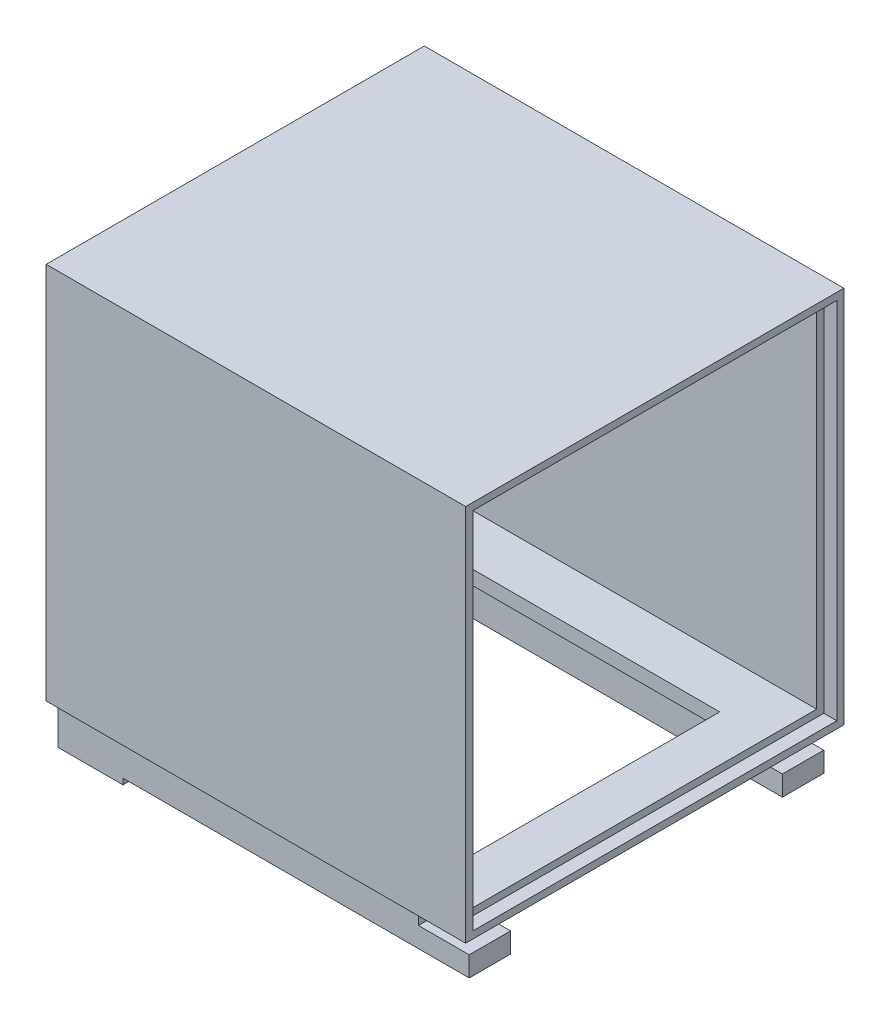
ISO-10303-21;
HEADER;
FILE_DESCRIPTION(('STEP AP214'),'2;1');
FILE_NAME('part.step','',(''),(''),'','','');
FILE_SCHEMA(('AUTOMOTIVE_DESIGN { 1 0 10303 214 1 1 1 1 }'));
ENDSEC;
DATA;
#1=APPLICATION_CONTEXT('core data for automotive mechanical design processes');
#2=APPLICATION_PROTOCOL_DEFINITION('international standard','automotive_design',2000,#1);
#3=PRODUCT_CONTEXT('',#1,'mechanical');
#4=PRODUCT('Part','Part','',(#3));
#5=PRODUCT_RELATED_PRODUCT_CATEGORY('part','',(#4));
#6=PRODUCT_DEFINITION_FORMATION('','',#4);
#7=PRODUCT_DEFINITION_CONTEXT('part definition',#1,'design');
#8=PRODUCT_DEFINITION('design','',#6,#7);
#9=PRODUCT_DEFINITION_SHAPE('','',#8);
#10=(LENGTH_UNIT() NAMED_UNIT(*) SI_UNIT(.MILLI.,.METRE.));
#11=(NAMED_UNIT(*) PLANE_ANGLE_UNIT() SI_UNIT($,.RADIAN.));
#12=(NAMED_UNIT(*) SI_UNIT($,.STERADIAN.) SOLID_ANGLE_UNIT());
#13=UNCERTAINTY_MEASURE_WITH_UNIT(LENGTH_MEASURE(1.E-05),#10,'distance_accuracy_value','');
#14=(GEOMETRIC_REPRESENTATION_CONTEXT(3) GLOBAL_UNCERTAINTY_ASSIGNED_CONTEXT((#13)) GLOBAL_UNIT_ASSIGNED_CONTEXT((#10,
#11,#12)) REPRESENTATION_CONTEXT('',''));
#15=CARTESIAN_POINT('',(0.,0.,0.));
#16=DIRECTION('',(0.,0.,1.));
#17=DIRECTION('',(1.,0.,0.));
#18=AXIS2_PLACEMENT_3D('',#15,#16,#17);
#19=CARTESIAN_POINT('',(0.,0.,0.));
#20=DIRECTION('',(0.,-1.,0.));
#21=DIRECTION('',(0.,0.,-1.));
#22=AXIS2_PLACEMENT_3D('',#19,#20,#21);
#23=PLANE('',#22);
#24=DIRECTION('',(0.,0.,-1.));
#25=VECTOR('',#24,1.);
#26=CARTESIAN_POINT('',(25.,0.,-55.));
#27=LINE('',#26,#25);
#28=CARTESIAN_POINT('',(25.,0.,-55.));
#29=VERTEX_POINT('',#28);
#30=CARTESIAN_POINT('',(25.,0.,-265.));
#31=VERTEX_POINT('',#30);
#32=EDGE_CURVE('E363',#29,#31,#27,.T.);
#33=ORIENTED_EDGE('',*,*,#32,.F.);
#34=DIRECTION('',(-1.,0.,0.));
#35=VECTOR('',#34,1.);
#36=CARTESIAN_POINT('',(25.,0.,-55.));
#37=LINE('',#36,#35);
#38=CARTESIAN_POINT('',(305.,0.,-55.));
#39=VERTEX_POINT('',#38);
#40=EDGE_CURVE('E371',#39,#29,#37,.T.);
#41=ORIENTED_EDGE('',*,*,#40,.F.);
#42=DIRECTION('',(0.,0.,1.));
#43=VECTOR('',#42,1.);
#44=CARTESIAN_POINT('',(305.,0.,-55.));
#45=LINE('',#44,#43);
#46=CARTESIAN_POINT('',(305.,0.,-265.));
#47=VERTEX_POINT('',#46);
#48=EDGE_CURVE('E368',#47,#39,#45,.T.);
#49=ORIENTED_EDGE('',*,*,#48,.F.);
#50=DIRECTION('',(1.,0.,0.));
#51=VECTOR('',#50,1.);
#52=CARTESIAN_POINT('',(25.,0.,-265.));
#53=LINE('',#52,#51);
#54=EDGE_CURVE('E365',#31,#47,#53,.T.);
#55=ORIENTED_EDGE('',*,*,#54,.F.);
#56=EDGE_LOOP('',(#33,#41,#49,#55));
#57=FACE_BOUND('',#56,.T.);
#58=DIRECTION('',(1.,0.,0.));
#59=VECTOR('',#58,1.);
#60=CARTESIAN_POINT('',(20.,0.,-45.));
#61=LINE('',#60,#59);
#62=CARTESIAN_POINT('',(20.,0.,-45.));
#63=VERTEX_POINT('',#62);
#64=CARTESIAN_POINT('',(305.,0.,-45.));
#65=VERTEX_POINT('',#64);
#66=EDGE_CURVE('E347',#63,#65,#61,.T.);
#67=ORIENTED_EDGE('',*,*,#66,.F.);
#68=DIRECTION('',(0.,0.,1.));
#69=VECTOR('',#68,1.);
#70=CARTESIAN_POINT('',(20.,0.,-10.));
#71=LINE('',#70,#69);
#72=CARTESIAN_POINT('',(20.,0.,-275.));
#73=VERTEX_POINT('',#72);
#74=EDGE_CURVE('E270',#73,#63,#71,.T.);
#75=ORIENTED_EDGE('',*,*,#74,.F.);
#76=DIRECTION('',(-1.,0.,0.));
#77=VECTOR('',#76,1.);
#78=CARTESIAN_POINT('',(20.,0.,-275.));
#79=LINE('',#78,#77);
#80=CARTESIAN_POINT('',(305.,0.,-275.));
#81=VERTEX_POINT('',#80);
#82=EDGE_CURVE('E333',#81,#73,#79,.T.);
#83=ORIENTED_EDGE('',*,*,#82,.F.);
#84=DIRECTION('',(0.,0.,1.));
#85=VECTOR('',#84,1.);
#86=CARTESIAN_POINT('',(305.,0.,-275.));
#87=LINE('',#86,#85);
#88=CARTESIAN_POINT('',(305.,0.,-310.));
#89=VERTEX_POINT('',#88);
#90=EDGE_CURVE('E335',#89,#81,#87,.T.);
#91=ORIENTED_EDGE('',*,*,#90,.F.);
#92=DIRECTION('',(1.,0.,0.));
#93=VECTOR('',#92,1.);
#94=CARTESIAN_POINT('',(20.,0.,-310.));
#95=LINE('',#94,#93);
#96=CARTESIAN_POINT('',(0.,0.,-310.));
#97=VERTEX_POINT('',#96);
#98=EDGE_CURVE('E328',#97,#89,#95,.T.);
#99=ORIENTED_EDGE('',*,*,#98,.F.);
#100=DIRECTION('',(0.,0.,1.));
#101=VECTOR('',#100,1.);
#102=CARTESIAN_POINT('',(0.,0.,0.));
#103=LINE('',#102,#101);
#104=CARTESIAN_POINT('',(0.,0.,-320.));
#105=VERTEX_POINT('',#104);
#106=EDGE_CURVE('E457',#105,#97,#103,.T.);
#107=ORIENTED_EDGE('',*,*,#106,.F.);
#108=DIRECTION('',(-1.,0.,0.));
#109=VECTOR('',#108,1.);
#110=CARTESIAN_POINT('',(0.,0.,-320.));
#111=LINE('',#110,#109);
#112=CARTESIAN_POINT('',(355.,0.,-320.));
#113=VERTEX_POINT('',#112);
#114=EDGE_CURVE('E450',#113,#105,#111,.T.);
#115=ORIENTED_EDGE('',*,*,#114,.F.);
#116=DIRECTION('',(0.,0.,-1.));
#117=VECTOR('',#116,1.);
#118=CARTESIAN_POINT('',(355.,0.,0.));
#119=LINE('',#118,#117);
#120=CARTESIAN_POINT('',(355.,0.,0.));
#121=VERTEX_POINT('',#120);
#122=EDGE_CURVE('E461',#121,#113,#119,.T.);
#123=ORIENTED_EDGE('',*,*,#122,.F.);
#124=DIRECTION('',(1.,0.,0.));
#125=VECTOR('',#124,1.);
#126=CARTESIAN_POINT('',(0.,0.,0.));
#127=LINE('',#126,#125);
#128=CARTESIAN_POINT('',(0.,0.,0.));
#129=VERTEX_POINT('',#128);
#130=EDGE_CURVE('E459',#129,#121,#127,.T.);
#131=ORIENTED_EDGE('',*,*,#130,.F.);
#132=CARTESIAN_POINT('',(0.,0.,-10.));
#133=VERTEX_POINT('',#132);
#134=EDGE_CURVE('E437',#133,#129,#103,.T.);
#135=ORIENTED_EDGE('',*,*,#134,.F.);
#136=DIRECTION('',(-1.,0.,0.));
#137=VECTOR('',#136,1.);
#138=CARTESIAN_POINT('',(20.,0.,-10.));
#139=LINE('',#138,#137);
#140=CARTESIAN_POINT('',(305.,0.,-10.));
#141=VERTEX_POINT('',#140);
#142=EDGE_CURVE('E262',#141,#133,#139,.T.);
#143=ORIENTED_EDGE('',*,*,#142,.F.);
#144=DIRECTION('',(0.,0.,1.));
#145=VECTOR('',#144,1.);
#146=CARTESIAN_POINT('',(305.,0.,-10.));
#147=LINE('',#146,#145);
#148=EDGE_CURVE('E353',#65,#141,#147,.T.);
#149=ORIENTED_EDGE('',*,*,#148,.F.);
#150=EDGE_LOOP('',(#67,#75,#83,#91,#99,#107,#115,#123,#131,#135,#143,#149));
#151=FACE_BOUND('',#150,.T.);
#152=ADVANCED_FACE('F42',(#57,#151),#23,.T.);
#153=CARTESIAN_POINT('',(0.,320.,0.));
#154=DIRECTION('',(1.,0.,0.));
#155=DIRECTION('',(0.,0.,-1.));
#156=AXIS2_PLACEMENT_3D('',#153,#154,#155);
#157=PLANE('',#156);
#158=ORIENTED_EDGE('',*,*,#106,.T.);
#159=DIRECTION('',(0.,1.,0.));
#160=VECTOR('',#159,1.);
#161=CARTESIAN_POINT('',(0.,-39.,-310.));
#162=LINE('',#161,#160);
#163=CARTESIAN_POINT('',(0.,-39.,-310.));
#164=VERTEX_POINT('',#163);
#165=EDGE_CURVE('E266',#164,#97,#162,.T.);
#166=ORIENTED_EDGE('',*,*,#165,.F.);
#167=DIRECTION('',(0.,0.,-1.));
#168=VECTOR('',#167,1.);
#169=CARTESIAN_POINT('',(0.,-39.,-10.));
#170=LINE('',#169,#168);
#171=CARTESIAN_POINT('',(0.,-39.,-10.));
#172=VERTEX_POINT('',#171);
#173=EDGE_CURVE('E249',#172,#164,#170,.T.);
#174=ORIENTED_EDGE('',*,*,#173,.F.);
#175=DIRECTION('',(0.,1.,0.));
#176=VECTOR('',#175,1.);
#177=CARTESIAN_POINT('',(0.,-39.,-10.));
#178=LINE('',#177,#176);
#179=EDGE_CURVE('E259',#172,#133,#178,.T.);
#180=ORIENTED_EDGE('',*,*,#179,.T.);
#181=ORIENTED_EDGE('',*,*,#134,.T.);
#182=DIRECTION('',(0.,-1.,0.));
#183=VECTOR('',#182,1.);
#184=CARTESIAN_POINT('',(0.,320.,0.));
#185=LINE('',#184,#183);
#186=CARTESIAN_POINT('',(0.,320.,0.));
#187=VERTEX_POINT('',#186);
#188=EDGE_CURVE('E472',#187,#129,#185,.T.);
#189=ORIENTED_EDGE('',*,*,#188,.F.);
#190=DIRECTION('',(0.,0.,1.));
#191=VECTOR('',#190,1.);
#192=CARTESIAN_POINT('',(0.,320.,0.));
#193=LINE('',#192,#191);
#194=CARTESIAN_POINT('',(0.,320.,-320.));
#195=VERTEX_POINT('',#194);
#196=EDGE_CURVE('E446',#195,#187,#193,.T.);
#197=ORIENTED_EDGE('',*,*,#196,.F.);
#198=DIRECTION('',(0.,-1.,0.));
#199=VECTOR('',#198,1.);
#200=CARTESIAN_POINT('',(0.,320.,-320.));
#201=LINE('',#200,#199);
#202=EDGE_CURVE('E456',#195,#105,#201,.T.);
#203=ORIENTED_EDGE('',*,*,#202,.T.);
#204=EDGE_LOOP('',(#158,#166,#174,#180,#181,#189,#197,#203));
#205=FACE_BOUND('',#204,.T.);
#206=ADVANCED_FACE('F44',(#205),#157,.F.);
#207=CARTESIAN_POINT('',(0.,320.,0.));
#208=DIRECTION('',(0.,0.,-1.));
#209=DIRECTION('',(-1.,0.,0.));
#210=AXIS2_PLACEMENT_3D('',#207,#208,#209);
#211=PLANE('',#210);
#212=ORIENTED_EDGE('',*,*,#130,.T.);
#213=DIRECTION('',(0.,-1.,0.));
#214=VECTOR('',#213,1.);
#215=CARTESIAN_POINT('',(355.,320.,0.));
#216=LINE('',#215,#214);
#217=CARTESIAN_POINT('',(355.,320.,0.));
#218=VERTEX_POINT('',#217);
#219=EDGE_CURVE('E469',#218,#121,#216,.T.);
#220=ORIENTED_EDGE('',*,*,#219,.F.);
#221=DIRECTION('',(1.,0.,0.));
#222=VECTOR('',#221,1.);
#223=CARTESIAN_POINT('',(0.,320.,0.));
#224=LINE('',#223,#222);
#225=EDGE_CURVE('E449',#187,#218,#224,.T.);
#226=ORIENTED_EDGE('',*,*,#225,.F.);
#227=ORIENTED_EDGE('',*,*,#188,.T.);
#228=EDGE_LOOP('',(#212,#220,#226,#227));
#229=FACE_BOUND('',#228,.T.);
#230=ADVANCED_FACE('F523',(#229),#211,.F.);
#231=CARTESIAN_POINT('',(355.,320.,0.));
#232=DIRECTION('',(-1.,0.,0.));
#233=DIRECTION('',(0.,0.,1.));
#234=AXIS2_PLACEMENT_3D('',#231,#232,#233);
#235=PLANE('',#234);
#236=DIRECTION('',(0.,0.,-1.));
#237=VECTOR('',#236,1.);
#238=CARTESIAN_POINT('',(355.,6.,-6.00000000000004));
#239=LINE('',#238,#237);
#240=CARTESIAN_POINT('',(355.,6.00000000000001,-6.00000000000003));
#241=VERTEX_POINT('',#240);
#242=CARTESIAN_POINT('',(355.,6.,-314.));
#243=VERTEX_POINT('',#242);
#244=EDGE_CURVE('E399',#241,#243,#239,.T.);
#245=ORIENTED_EDGE('',*,*,#244,.F.);
#246=DIRECTION('',(0.,-1.,0.));
#247=VECTOR('',#246,1.);
#248=CARTESIAN_POINT('',(355.,314.,-6.));
#249=LINE('',#248,#247);
#250=CARTESIAN_POINT('',(355.,314.,-6.));
#251=VERTEX_POINT('',#250);
#252=EDGE_CURVE('E377',#251,#241,#249,.T.);
#253=ORIENTED_EDGE('',*,*,#252,.F.);
#254=DIRECTION('',(0.,0.,1.));
#255=VECTOR('',#254,1.);
#256=CARTESIAN_POINT('',(355.,314.,-6.));
#257=LINE('',#256,#255);
#258=CARTESIAN_POINT('',(355.,314.,-314.));
#259=VERTEX_POINT('',#258);
#260=EDGE_CURVE('E388',#259,#251,#257,.T.);
#261=ORIENTED_EDGE('',*,*,#260,.F.);
#262=DIRECTION('',(0.,1.,0.));
#263=VECTOR('',#262,1.);
#264=CARTESIAN_POINT('',(355.,314.,-314.));
#265=LINE('',#264,#263);
#266=EDGE_CURVE('E402',#243,#259,#265,.T.);
#267=ORIENTED_EDGE('',*,*,#266,.F.);
#268=EDGE_LOOP('',(#245,#253,#261,#267));
#269=FACE_BOUND('',#268,.T.);
#270=ORIENTED_EDGE('',*,*,#122,.T.);
#271=DIRECTION('',(0.,-1.,0.));
#272=VECTOR('',#271,1.);
#273=CARTESIAN_POINT('',(355.,320.,-320.));
#274=LINE('',#273,#272);
#275=CARTESIAN_POINT('',(355.,320.,-320.));
#276=VERTEX_POINT('',#275);
#277=EDGE_CURVE('E466',#276,#113,#274,.T.);
#278=ORIENTED_EDGE('',*,*,#277,.F.);
#279=DIRECTION('',(0.,0.,-1.));
#280=VECTOR('',#279,1.);
#281=CARTESIAN_POINT('',(355.,320.,0.));
#282=LINE('',#281,#280);
#283=EDGE_CURVE('E452',#218,#276,#282,.T.);
#284=ORIENTED_EDGE('',*,*,#283,.F.);
#285=ORIENTED_EDGE('',*,*,#219,.T.);
#286=EDGE_LOOP('',(#270,#278,#284,#285));
#287=FACE_BOUND('',#286,.T.);
#288=ADVANCED_FACE('F531',(#269,#287),#235,.F.);
#289=CARTESIAN_POINT('',(0.,320.,-320.));
#290=DIRECTION('',(0.,0.,1.));
#291=DIRECTION('',(1.,0.,0.));
#292=AXIS2_PLACEMENT_3D('',#289,#290,#291);
#293=PLANE('',#292);
#294=ORIENTED_EDGE('',*,*,#114,.T.);
#295=ORIENTED_EDGE('',*,*,#202,.F.);
#296=DIRECTION('',(-1.,0.,0.));
#297=VECTOR('',#296,1.);
#298=CARTESIAN_POINT('',(0.,320.,-320.));
#299=LINE('',#298,#297);
#300=EDGE_CURVE('E454',#276,#195,#299,.T.);
#301=ORIENTED_EDGE('',*,*,#300,.F.);
#302=ORIENTED_EDGE('',*,*,#277,.T.);
#303=EDGE_LOOP('',(#294,#295,#301,#302));
#304=FACE_BOUND('',#303,.T.);
#305=ADVANCED_FACE('F528',(#304),#293,.F.);
#306=CARTESIAN_POINT('',(0.,320.,0.));
#307=DIRECTION('',(0.,-1.,0.));
#308=DIRECTION('',(0.,0.,-1.));
#309=AXIS2_PLACEMENT_3D('',#306,#307,#308);
#310=PLANE('',#309);
#311=ORIENTED_EDGE('',*,*,#196,.T.);
#312=ORIENTED_EDGE('',*,*,#225,.T.);
#313=ORIENTED_EDGE('',*,*,#283,.T.);
#314=ORIENTED_EDGE('',*,*,#300,.T.);
#315=EDGE_LOOP('',(#311,#312,#313,#314));
#316=FACE_BOUND('',#315,.T.);
#317=ADVANCED_FACE('F526',(#316),#310,.F.);
#318=CARTESIAN_POINT('',(344.,0.,-1.2414762580153E-13));
#319=DIRECTION('',(1.,0.,0.));
#320=DIRECTION('',(0.,0.,-1.));
#321=AXIS2_PLACEMENT_3D('',#318,#319,#320);
#322=PLANE('',#321);
#323=DIRECTION('',(0.,-1.,0.));
#324=VECTOR('',#323,1.);
#325=CARTESIAN_POINT('',(344.,314.,-6.));
#326=LINE('',#325,#324);
#327=CARTESIAN_POINT('',(344.,314.,-6.));
#328=VERTEX_POINT('',#327);
#329=CARTESIAN_POINT('',(344.,6.,-6.00000000000003));
#330=VERTEX_POINT('',#329);
#331=EDGE_CURVE('E384',#328,#330,#326,.T.);
#332=ORIENTED_EDGE('',*,*,#331,.T.);
#333=DIRECTION('',(0.,0.,-1.));
#334=VECTOR('',#333,1.);
#335=CARTESIAN_POINT('',(344.,6.,-6.00000000000003));
#336=LINE('',#335,#334);
#337=CARTESIAN_POINT('',(344.,6.,-314.));
#338=VERTEX_POINT('',#337);
#339=EDGE_CURVE('E387',#330,#338,#336,.T.);
#340=ORIENTED_EDGE('',*,*,#339,.T.);
#341=DIRECTION('',(0.,1.,0.));
#342=VECTOR('',#341,1.);
#343=CARTESIAN_POINT('',(344.,314.,-314.));
#344=LINE('',#343,#342);
#345=CARTESIAN_POINT('',(344.,314.,-314.));
#346=VERTEX_POINT('',#345);
#347=EDGE_CURVE('E391',#338,#346,#344,.T.);
#348=ORIENTED_EDGE('',*,*,#347,.T.);
#349=DIRECTION('',(0.,0.,1.));
#350=VECTOR('',#349,1.);
#351=CARTESIAN_POINT('',(344.,314.,-6.));
#352=LINE('',#351,#350);
#353=EDGE_CURVE('E394',#346,#328,#352,.T.);
#354=ORIENTED_EDGE('',*,*,#353,.T.);
#355=EDGE_LOOP('',(#332,#340,#348,#354));
#356=FACE_BOUND('',#355,.T.);
#357=DIRECTION('',(0.,1.,0.));
#358=VECTOR('',#357,1.);
#359=CARTESIAN_POINT('',(344.,308.,-12.));
#360=LINE('',#359,#358);
#361=CARTESIAN_POINT('',(344.,12.,-11.9999999999999));
#362=VERTEX_POINT('',#361);
#363=CARTESIAN_POINT('',(344.,308.,-11.9999999999999));
#364=VERTEX_POINT('',#363);
#365=EDGE_CURVE('E419',#362,#364,#360,.T.);
#366=ORIENTED_EDGE('',*,*,#365,.T.);
#367=DIRECTION('',(0.,0.,-1.));
#368=VECTOR('',#367,1.);
#369=CARTESIAN_POINT('',(344.,308.,-12.));
#370=LINE('',#369,#368);
#371=CARTESIAN_POINT('',(344.,308.,-308.));
#372=VERTEX_POINT('',#371);
#373=EDGE_CURVE('E417',#364,#372,#370,.T.);
#374=ORIENTED_EDGE('',*,*,#373,.T.);
#375=DIRECTION('',(0.,-1.,0.));
#376=VECTOR('',#375,1.);
#377=CARTESIAN_POINT('',(344.,308.,-308.));
#378=LINE('',#377,#376);
#379=CARTESIAN_POINT('',(344.,12.,-308.));
#380=VERTEX_POINT('',#379);
#381=EDGE_CURVE('E409',#372,#380,#378,.T.);
#382=ORIENTED_EDGE('',*,*,#381,.T.);
#383=DIRECTION('',(0.,0.,1.));
#384=VECTOR('',#383,1.);
#385=CARTESIAN_POINT('',(344.,12.,-12.));
#386=LINE('',#385,#384);
#387=EDGE_CURVE('E475',#380,#362,#386,.T.);
#388=ORIENTED_EDGE('',*,*,#387,.T.);
#389=EDGE_LOOP('',(#366,#374,#382,#388));
#390=FACE_BOUND('',#389,.T.);
#391=ADVANCED_FACE('F554',(#356,#390),#322,.T.);
#392=CARTESIAN_POINT('',(344.,314.,-6.));
#393=DIRECTION('',(0.,0.,1.));
#394=DIRECTION('',(1.,0.,0.));
#395=AXIS2_PLACEMENT_3D('',#392,#393,#394);
#396=PLANE('',#395);
#397=ORIENTED_EDGE('',*,*,#252,.T.);
#398=DIRECTION('',(1.,0.,0.));
#399=VECTOR('',#398,1.);
#400=CARTESIAN_POINT('',(344.,6.,-6.00000000000003));
#401=LINE('',#400,#399);
#402=EDGE_CURVE('E397',#330,#241,#401,.T.);
#403=ORIENTED_EDGE('',*,*,#402,.F.);
#404=ORIENTED_EDGE('',*,*,#331,.F.);
#405=DIRECTION('',(1.,0.,0.));
#406=VECTOR('',#405,1.);
#407=CARTESIAN_POINT('',(344.,314.,-6.));
#408=LINE('',#407,#406);
#409=EDGE_CURVE('E407',#328,#251,#408,.T.);
#410=ORIENTED_EDGE('',*,*,#409,.T.);
#411=EDGE_LOOP('',(#397,#403,#404,#410));
#412=FACE_BOUND('',#411,.T.);
#413=ADVANCED_FACE('F559',(#412),#396,.F.);
#414=CARTESIAN_POINT('',(344.,314.,-6.));
#415=DIRECTION('',(0.,1.,0.));
#416=DIRECTION('',(0.,0.,1.));
#417=AXIS2_PLACEMENT_3D('',#414,#415,#416);
#418=PLANE('',#417);
#419=ORIENTED_EDGE('',*,*,#260,.T.);
#420=ORIENTED_EDGE('',*,*,#409,.F.);
#421=ORIENTED_EDGE('',*,*,#353,.F.);
#422=DIRECTION('',(1.,0.,0.));
#423=VECTOR('',#422,1.);
#424=CARTESIAN_POINT('',(344.,314.,-314.));
#425=LINE('',#424,#423);
#426=EDGE_CURVE('E410',#346,#259,#425,.T.);
#427=ORIENTED_EDGE('',*,*,#426,.T.);
#428=EDGE_LOOP('',(#419,#420,#421,#427));
#429=FACE_BOUND('',#428,.T.);
#430=ADVANCED_FACE('F565',(#429),#418,.F.);
#431=CARTESIAN_POINT('',(344.,314.,-314.));
#432=DIRECTION('',(0.,0.,-1.));
#433=DIRECTION('',(-1.,0.,0.));
#434=AXIS2_PLACEMENT_3D('',#431,#432,#433);
#435=PLANE('',#434);
#436=ORIENTED_EDGE('',*,*,#266,.T.);
#437=ORIENTED_EDGE('',*,*,#426,.F.);
#438=ORIENTED_EDGE('',*,*,#347,.F.);
#439=DIRECTION('',(1.,0.,0.));
#440=VECTOR('',#439,1.);
#441=CARTESIAN_POINT('',(344.,6.,-314.));
#442=LINE('',#441,#440);
#443=EDGE_CURVE('E412',#338,#243,#442,.T.);
#444=ORIENTED_EDGE('',*,*,#443,.T.);
#445=EDGE_LOOP('',(#436,#437,#438,#444));
#446=FACE_BOUND('',#445,.T.);
#447=ADVANCED_FACE('F572',(#446),#435,.F.);
#448=CARTESIAN_POINT('',(344.,6.,-6.00000000000003));
#449=DIRECTION('',(0.,-1.,0.));
#450=DIRECTION('',(0.,0.,-1.));
#451=AXIS2_PLACEMENT_3D('',#448,#449,#450);
#452=PLANE('',#451);
#453=ORIENTED_EDGE('',*,*,#244,.T.);
#454=ORIENTED_EDGE('',*,*,#443,.F.);
#455=ORIENTED_EDGE('',*,*,#339,.F.);
#456=ORIENTED_EDGE('',*,*,#402,.T.);
#457=EDGE_LOOP('',(#453,#454,#455,#456));
#458=FACE_BOUND('',#457,.T.);
#459=ADVANCED_FACE('F576',(#458),#452,.F.);
#460=CARTESIAN_POINT('',(10.0000000000001,0.,0.));
#461=DIRECTION('',(1.,0.,0.));
#462=DIRECTION('',(0.,0.,-1.));
#463=AXIS2_PLACEMENT_3D('',#460,#461,#462);
#464=PLANE('',#463);
#465=DIRECTION('',(0.,-1.,0.));
#466=VECTOR('',#465,1.);
#467=CARTESIAN_POINT('',(10.0000000000001,308.,-11.9999999999999));
#468=LINE('',#467,#466);
#469=CARTESIAN_POINT('',(10.0000000000001,308.,-11.9999999999999));
#470=VERTEX_POINT('',#469);
#471=CARTESIAN_POINT('',(10.0000000000001,12.,-11.9999999999999));
#472=VERTEX_POINT('',#471);
#473=EDGE_CURVE('E421',#470,#472,#468,.T.);
#474=ORIENTED_EDGE('',*,*,#473,.T.);
#475=DIRECTION('',(0.,0.,-1.));
#476=VECTOR('',#475,1.);
#477=CARTESIAN_POINT('',(10.0000000000001,12.,-11.9999999999999));
#478=LINE('',#477,#476);
#479=CARTESIAN_POINT('',(9.99999999999995,12.,-308.));
#480=VERTEX_POINT('',#479);
#481=EDGE_CURVE('E424',#472,#480,#478,.T.);
#482=ORIENTED_EDGE('',*,*,#481,.T.);
#483=DIRECTION('',(0.,1.,0.));
#484=VECTOR('',#483,1.);
#485=CARTESIAN_POINT('',(9.99999999999995,308.,-308.));
#486=LINE('',#485,#484);
#487=CARTESIAN_POINT('',(9.99999999999995,308.,-308.));
#488=VERTEX_POINT('',#487);
#489=EDGE_CURVE('E427',#480,#488,#486,.T.);
#490=ORIENTED_EDGE('',*,*,#489,.T.);
#491=DIRECTION('',(0.,0.,1.));
#492=VECTOR('',#491,1.);
#493=CARTESIAN_POINT('',(10.0000000000001,308.,-11.9999999999999));
#494=LINE('',#493,#492);
#495=EDGE_CURVE('E430',#488,#470,#494,.T.);
#496=ORIENTED_EDGE('',*,*,#495,.T.);
#497=EDGE_LOOP('',(#474,#482,#490,#496));
#498=FACE_BOUND('',#497,.T.);
#499=ADVANCED_FACE('F579',(#498),#464,.T.);
#500=CARTESIAN_POINT('',(10.0000000000001,12.,-11.9999999999999));
#501=DIRECTION('',(0.,-1.,0.));
#502=DIRECTION('',(0.,0.,-1.));
#503=AXIS2_PLACEMENT_3D('',#500,#501,#502);
#504=PLANE('',#503);
#505=DIRECTION('',(-1.,0.,0.));
#506=VECTOR('',#505,1.);
#507=CARTESIAN_POINT('',(10.0000000000001,12.,-55.));
#508=LINE('',#507,#506);
#509=CARTESIAN_POINT('',(305.,12.,-55.));
#510=VERTEX_POINT('',#509);
#511=CARTESIAN_POINT('',(25.,12.,-55.));
#512=VERTEX_POINT('',#511);
#513=EDGE_CURVE('E50',#510,#512,#508,.T.);
#514=ORIENTED_EDGE('',*,*,#513,.T.);
#515=DIRECTION('',(0.,0.,-1.));
#516=VECTOR('',#515,1.);
#517=CARTESIAN_POINT('',(25.,12.,-11.9999999999999));
#518=LINE('',#517,#516);
#519=CARTESIAN_POINT('',(25.,12.,-265.));
#520=VERTEX_POINT('',#519);
#521=EDGE_CURVE('E11',#512,#520,#518,.T.);
#522=ORIENTED_EDGE('',*,*,#521,.T.);
#523=DIRECTION('',(1.,0.,0.));
#524=VECTOR('',#523,1.);
#525=CARTESIAN_POINT('',(10.0000000000001,12.,-265.));
#526=LINE('',#525,#524);
#527=CARTESIAN_POINT('',(305.,12.,-265.));
#528=VERTEX_POINT('',#527);
#529=EDGE_CURVE('E477',#520,#528,#526,.T.);
#530=ORIENTED_EDGE('',*,*,#529,.T.);
#531=DIRECTION('',(0.,0.,1.));
#532=VECTOR('',#531,1.);
#533=CARTESIAN_POINT('',(305.,12.,-11.9999999999998));
#534=LINE('',#533,#532);
#535=EDGE_CURVE('E480',#528,#510,#534,.T.);
#536=ORIENTED_EDGE('',*,*,#535,.T.);
#537=EDGE_LOOP('',(#514,#522,#530,#536));
#538=FACE_BOUND('',#537,.T.);
#539=ORIENTED_EDGE('',*,*,#387,.F.);
#540=DIRECTION('',(1.,0.,0.));
#541=VECTOR('',#540,1.);
#542=CARTESIAN_POINT('',(9.99999999999995,12.,-308.));
#543=LINE('',#542,#541);
#544=EDGE_CURVE('E441',#480,#380,#543,.T.);
#545=ORIENTED_EDGE('',*,*,#544,.F.);
#546=ORIENTED_EDGE('',*,*,#481,.F.);
#547=DIRECTION('',(1.,0.,0.));
#548=VECTOR('',#547,1.);
#549=CARTESIAN_POINT('',(10.0000000000001,12.,-11.9999999999999));
#550=LINE('',#549,#548);
#551=EDGE_CURVE('E433',#472,#362,#550,.T.);
#552=ORIENTED_EDGE('',*,*,#551,.T.);
#553=EDGE_LOOP('',(#539,#545,#546,#552));
#554=FACE_BOUND('',#553,.T.);
#555=ADVANCED_FACE('F484',(#538,#554),#504,.F.);
#556=CARTESIAN_POINT('',(9.99999999999995,308.,-308.));
#557=DIRECTION('',(0.,0.,-1.));
#558=DIRECTION('',(-1.,0.,0.));
#559=AXIS2_PLACEMENT_3D('',#556,#557,#558);
#560=PLANE('',#559);
#561=ORIENTED_EDGE('',*,*,#381,.F.);
#562=DIRECTION('',(1.,0.,0.));
#563=VECTOR('',#562,1.);
#564=CARTESIAN_POINT('',(9.99999999999995,308.,-308.));
#565=LINE('',#564,#563);
#566=EDGE_CURVE('E438',#488,#372,#565,.T.);
#567=ORIENTED_EDGE('',*,*,#566,.F.);
#568=ORIENTED_EDGE('',*,*,#489,.F.);
#569=ORIENTED_EDGE('',*,*,#544,.T.);
#570=EDGE_LOOP('',(#561,#567,#568,#569));
#571=FACE_BOUND('',#570,.T.);
#572=ADVANCED_FACE('F588',(#571),#560,.F.);
#573=CARTESIAN_POINT('',(10.0000000000001,308.,-11.9999999999999));
#574=DIRECTION('',(0.,1.,0.));
#575=DIRECTION('',(0.,0.,1.));
#576=AXIS2_PLACEMENT_3D('',#573,#574,#575);
#577=PLANE('',#576);
#578=ORIENTED_EDGE('',*,*,#373,.F.);
#579=DIRECTION('',(1.,0.,0.));
#580=VECTOR('',#579,1.);
#581=CARTESIAN_POINT('',(10.0000000000001,308.,-11.9999999999999));
#582=LINE('',#581,#580);
#583=EDGE_CURVE('E434',#470,#364,#582,.T.);
#584=ORIENTED_EDGE('',*,*,#583,.F.);
#585=ORIENTED_EDGE('',*,*,#495,.F.);
#586=ORIENTED_EDGE('',*,*,#566,.T.);
#587=EDGE_LOOP('',(#578,#584,#585,#586));
#588=FACE_BOUND('',#587,.T.);
#589=ADVANCED_FACE('F584',(#588),#577,.F.);
#590=CARTESIAN_POINT('',(10.0000000000001,308.,-11.9999999999999));
#591=DIRECTION('',(0.,0.,1.));
#592=DIRECTION('',(1.,0.,0.));
#593=AXIS2_PLACEMENT_3D('',#590,#591,#592);
#594=PLANE('',#593);
#595=ORIENTED_EDGE('',*,*,#365,.F.);
#596=ORIENTED_EDGE('',*,*,#551,.F.);
#597=ORIENTED_EDGE('',*,*,#473,.F.);
#598=ORIENTED_EDGE('',*,*,#583,.T.);
#599=EDGE_LOOP('',(#595,#596,#597,#598));
#600=FACE_BOUND('',#599,.T.);
#601=ADVANCED_FACE('F587',(#600),#594,.F.);
#602=CARTESIAN_POINT('',(25.,20.,-55.));
#603=DIRECTION('',(-1.,0.,0.));
#604=DIRECTION('',(0.,0.,1.));
#605=AXIS2_PLACEMENT_3D('',#602,#603,#604);
#606=PLANE('',#605);
#607=DIRECTION('',(0.,-1.,0.));
#608=VECTOR('',#607,1.);
#609=CARTESIAN_POINT('',(25.,20.,-55.));
#610=LINE('',#609,#608);
#611=EDGE_CURVE('E375',#512,#29,#610,.T.);
#612=ORIENTED_EDGE('',*,*,#611,.T.);
#613=ORIENTED_EDGE('',*,*,#32,.T.);
#614=DIRECTION('',(0.,-1.,0.));
#615=VECTOR('',#614,1.);
#616=CARTESIAN_POINT('',(25.,20.,-265.));
#617=LINE('',#616,#615);
#618=EDGE_CURVE('E374',#520,#31,#617,.T.);
#619=ORIENTED_EDGE('',*,*,#618,.F.);
#620=ORIENTED_EDGE('',*,*,#521,.F.);
#621=EDGE_LOOP('',(#612,#613,#619,#620));
#622=FACE_BOUND('',#621,.T.);
#623=ADVANCED_FACE('F501',(#622),#606,.F.);
#624=CARTESIAN_POINT('',(25.,20.,-55.));
#625=DIRECTION('',(0.,0.,1.));
#626=DIRECTION('',(1.,0.,0.));
#627=AXIS2_PLACEMENT_3D('',#624,#625,#626);
#628=PLANE('',#627);
#629=DIRECTION('',(0.,-1.,0.));
#630=VECTOR('',#629,1.);
#631=CARTESIAN_POINT('',(305.,20.,-55.));
#632=LINE('',#631,#630);
#633=EDGE_CURVE('E378',#510,#39,#632,.T.);
#634=ORIENTED_EDGE('',*,*,#633,.T.);
#635=ORIENTED_EDGE('',*,*,#40,.T.);
#636=ORIENTED_EDGE('',*,*,#611,.F.);
#637=ORIENTED_EDGE('',*,*,#513,.F.);
#638=EDGE_LOOP('',(#634,#635,#636,#637));
#639=FACE_BOUND('',#638,.T.);
#640=ADVANCED_FACE('F490',(#639),#628,.F.);
#641=CARTESIAN_POINT('',(305.,20.,-55.));
#642=DIRECTION('',(1.,0.,0.));
#643=DIRECTION('',(0.,0.,-1.));
#644=AXIS2_PLACEMENT_3D('',#641,#642,#643);
#645=PLANE('',#644);
#646=DIRECTION('',(0.,-1.,0.));
#647=VECTOR('',#646,1.);
#648=CARTESIAN_POINT('',(305.,20.,-265.));
#649=LINE('',#648,#647);
#650=EDGE_CURVE('E380',#528,#47,#649,.T.);
#651=ORIENTED_EDGE('',*,*,#650,.T.);
#652=ORIENTED_EDGE('',*,*,#48,.T.);
#653=ORIENTED_EDGE('',*,*,#633,.F.);
#654=ORIENTED_EDGE('',*,*,#535,.F.);
#655=EDGE_LOOP('',(#651,#652,#653,#654));
#656=FACE_BOUND('',#655,.T.);
#657=ADVANCED_FACE('F492',(#656),#645,.F.);
#658=CARTESIAN_POINT('',(25.,20.,-265.));
#659=DIRECTION('',(0.,0.,-1.));
#660=DIRECTION('',(-1.,0.,0.));
#661=AXIS2_PLACEMENT_3D('',#658,#659,#660);
#662=PLANE('',#661);
#663=ORIENTED_EDGE('',*,*,#618,.T.);
#664=ORIENTED_EDGE('',*,*,#54,.T.);
#665=ORIENTED_EDGE('',*,*,#650,.F.);
#666=ORIENTED_EDGE('',*,*,#529,.F.);
#667=EDGE_LOOP('',(#663,#664,#665,#666));
#668=FACE_BOUND('',#667,.T.);
#669=ADVANCED_FACE('F503',(#668),#662,.F.);
#670=CARTESIAN_POINT('',(20.,-17.,-45.));
#671=DIRECTION('',(0.,0.,1.));
#672=DIRECTION('',(1.,0.,0.));
#673=AXIS2_PLACEMENT_3D('',#670,#671,#672);
#674=PLANE('',#673);
#675=ORIENTED_EDGE('',*,*,#66,.T.);
#676=DIRECTION('',(0.,1.,0.));
#677=VECTOR('',#676,1.);
#678=CARTESIAN_POINT('',(305.,-17.,-45.));
#679=LINE('',#678,#677);
#680=CARTESIAN_POINT('',(305.,-17.,-45.));
#681=VERTEX_POINT('',#680);
#682=EDGE_CURVE('E358',#681,#65,#679,.T.);
#683=ORIENTED_EDGE('',*,*,#682,.F.);
#684=DIRECTION('',(1.,0.,0.));
#685=VECTOR('',#684,1.);
#686=CARTESIAN_POINT('',(20.,-17.,-45.));
#687=LINE('',#686,#685);
#688=CARTESIAN_POINT('',(348.,-17.,-45.));
#689=VERTEX_POINT('',#688);
#690=EDGE_CURVE('E302',#681,#689,#687,.T.);
#691=ORIENTED_EDGE('',*,*,#690,.T.);
#692=DIRECTION('',(0.,1.,0.));
#693=VECTOR('',#692,1.);
#694=CARTESIAN_POINT('',(348.,-34.,-45.));
#695=LINE('',#694,#693);
#696=CARTESIAN_POINT('',(348.,-34.,-45.));
#697=VERTEX_POINT('',#696);
#698=EDGE_CURVE('E325',#697,#689,#695,.T.);
#699=ORIENTED_EDGE('',*,*,#698,.F.);
#700=DIRECTION('',(1.,0.,0.));
#701=VECTOR('',#700,1.);
#702=CARTESIAN_POINT('',(20.,-34.,-45.));
#703=LINE('',#702,#701);
#704=CARTESIAN_POINT('',(55.,-34.,-45.));
#705=VERTEX_POINT('',#704);
#706=EDGE_CURVE('E312',#705,#697,#703,.T.);
#707=ORIENTED_EDGE('',*,*,#706,.F.);
#708=CARTESIAN_POINT('',(20.,-34.,-45.));
#709=VERTEX_POINT('',#708);
#710=EDGE_CURVE('E308',#709,#705,#703,.T.);
#711=ORIENTED_EDGE('',*,*,#710,.F.);
#712=DIRECTION('',(0.,1.,0.));
#713=VECTOR('',#712,1.);
#714=CARTESIAN_POINT('',(20.,-17.,-45.));
#715=LINE('',#714,#713);
#716=EDGE_CURVE('E361',#709,#63,#715,.T.);
#717=ORIENTED_EDGE('',*,*,#716,.T.);
#718=EDGE_LOOP('',(#675,#683,#691,#699,#707,#711,#717));
#719=FACE_BOUND('',#718,.T.);
#720=ADVANCED_FACE('F505',(#719),#674,.F.);
#721=CARTESIAN_POINT('',(305.,-17.,-10.));
#722=DIRECTION('',(-1.,0.,0.));
#723=DIRECTION('',(0.,0.,1.));
#724=AXIS2_PLACEMENT_3D('',#721,#722,#723);
#725=PLANE('',#724);
#726=ORIENTED_EDGE('',*,*,#148,.T.);
#727=DIRECTION('',(0.,1.,0.));
#728=VECTOR('',#727,1.);
#729=CARTESIAN_POINT('',(305.,-17.,-10.));
#730=LINE('',#729,#728);
#731=CARTESIAN_POINT('',(305.,-17.,-10.));
#732=VERTEX_POINT('',#731);
#733=EDGE_CURVE('E351',#732,#141,#730,.T.);
#734=ORIENTED_EDGE('',*,*,#733,.F.);
#735=DIRECTION('',(0.,0.,1.));
#736=VECTOR('',#735,1.);
#737=CARTESIAN_POINT('',(305.,-17.,-10.));
#738=LINE('',#737,#736);
#739=EDGE_CURVE('E348',#681,#732,#738,.T.);
#740=ORIENTED_EDGE('',*,*,#739,.F.);
#741=ORIENTED_EDGE('',*,*,#682,.T.);
#742=EDGE_LOOP('',(#726,#734,#740,#741));
#743=FACE_BOUND('',#742,.T.);
#744=ADVANCED_FACE('F512',(#743),#725,.F.);
#745=CARTESIAN_POINT('',(20.,-17.,-10.));
#746=DIRECTION('',(0.,0.,-1.));
#747=DIRECTION('',(-1.,0.,0.));
#748=AXIS2_PLACEMENT_3D('',#745,#746,#747);
#749=PLANE('',#748);
#750=ORIENTED_EDGE('',*,*,#142,.T.);
#751=ORIENTED_EDGE('',*,*,#179,.F.);
#752=DIRECTION('',(-1.,0.,0.));
#753=VECTOR('',#752,1.);
#754=CARTESIAN_POINT('',(20.,-39.,-10.));
#755=LINE('',#754,#753);
#756=CARTESIAN_POINT('',(54.9999999999999,-39.,-10.));
#757=VERTEX_POINT('',#756);
#758=EDGE_CURVE('E245',#757,#172,#755,.T.);
#759=ORIENTED_EDGE('',*,*,#758,.F.);
#760=DIRECTION('',(0.,1.,0.));
#761=VECTOR('',#760,1.);
#762=CARTESIAN_POINT('',(54.9999999999999,-39.,-10.));
#763=LINE('',#762,#761);
#764=CARTESIAN_POINT('',(54.9999999999999,-34.,-10.));
#765=VERTEX_POINT('',#764);
#766=EDGE_CURVE('E256',#757,#765,#763,.T.);
#767=ORIENTED_EDGE('',*,*,#766,.T.);
#768=DIRECTION('',(-1.,0.,0.));
#769=VECTOR('',#768,1.);
#770=CARTESIAN_POINT('',(20.,-34.,-10.));
#771=LINE('',#770,#769);
#772=CARTESIAN_POINT('',(348.,-34.,-10.));
#773=VERTEX_POINT('',#772);
#774=EDGE_CURVE('E314',#773,#765,#771,.T.);
#775=ORIENTED_EDGE('',*,*,#774,.F.);
#776=DIRECTION('',(0.,1.,0.));
#777=VECTOR('',#776,1.);
#778=CARTESIAN_POINT('',(348.,-34.,-10.));
#779=LINE('',#778,#777);
#780=CARTESIAN_POINT('',(348.,-17.,-10.));
#781=VERTEX_POINT('',#780);
#782=EDGE_CURVE('E316',#773,#781,#779,.T.);
#783=ORIENTED_EDGE('',*,*,#782,.T.);
#784=DIRECTION('',(-1.,0.,0.));
#785=VECTOR('',#784,1.);
#786=CARTESIAN_POINT('',(20.,-17.,-10.));
#787=LINE('',#786,#785);
#788=EDGE_CURVE('E320',#781,#732,#787,.T.);
#789=ORIENTED_EDGE('',*,*,#788,.T.);
#790=ORIENTED_EDGE('',*,*,#733,.T.);
#791=EDGE_LOOP('',(#750,#751,#759,#767,#775,#783,#789,#790));
#792=FACE_BOUND('',#791,.T.);
#793=ADVANCED_FACE('F260',(#792),#749,.F.);
#794=CARTESIAN_POINT('',(20.,-17.,-310.));
#795=DIRECTION('',(0.,0.,1.));
#796=DIRECTION('',(1.,0.,0.));
#797=AXIS2_PLACEMENT_3D('',#794,#795,#796);
#798=PLANE('',#797);
#799=ORIENTED_EDGE('',*,*,#98,.T.);
#800=DIRECTION('',(0.,1.,0.));
#801=VECTOR('',#800,1.);
#802=CARTESIAN_POINT('',(305.,-17.,-310.));
#803=LINE('',#802,#801);
#804=CARTESIAN_POINT('',(305.,-17.,-310.));
#805=VERTEX_POINT('',#804);
#806=EDGE_CURVE('E344',#805,#89,#803,.T.);
#807=ORIENTED_EDGE('',*,*,#806,.F.);
#808=DIRECTION('',(1.,0.,0.));
#809=VECTOR('',#808,1.);
#810=CARTESIAN_POINT('',(20.,-17.,-310.));
#811=LINE('',#810,#809);
#812=CARTESIAN_POINT('',(348.,-17.,-310.));
#813=VERTEX_POINT('',#812);
#814=EDGE_CURVE('E300',#805,#813,#811,.T.);
#815=ORIENTED_EDGE('',*,*,#814,.T.);
#816=DIRECTION('',(0.,1.,0.));
#817=VECTOR('',#816,1.);
#818=CARTESIAN_POINT('',(348.,-34.,-310.));
#819=LINE('',#818,#817);
#820=CARTESIAN_POINT('',(348.,-34.,-310.));
#821=VERTEX_POINT('',#820);
#822=EDGE_CURVE('E287',#821,#813,#819,.T.);
#823=ORIENTED_EDGE('',*,*,#822,.F.);
#824=DIRECTION('',(1.,0.,0.));
#825=VECTOR('',#824,1.);
#826=CARTESIAN_POINT('',(20.,-34.,-310.));
#827=LINE('',#826,#825);
#828=CARTESIAN_POINT('',(55.,-34.,-310.));
#829=VERTEX_POINT('',#828);
#830=EDGE_CURVE('E298',#829,#821,#827,.T.);
#831=ORIENTED_EDGE('',*,*,#830,.F.);
#832=DIRECTION('',(0.,1.,0.));
#833=VECTOR('',#832,1.);
#834=CARTESIAN_POINT('',(55.,-39.,-310.));
#835=LINE('',#834,#833);
#836=CARTESIAN_POINT('',(55.,-39.,-310.));
#837=VERTEX_POINT('',#836);
#838=EDGE_CURVE('E284',#837,#829,#835,.T.);
#839=ORIENTED_EDGE('',*,*,#838,.F.);
#840=DIRECTION('',(1.,0.,0.));
#841=VECTOR('',#840,1.);
#842=CARTESIAN_POINT('',(20.,-39.,-310.));
#843=LINE('',#842,#841);
#844=EDGE_CURVE('E276',#164,#837,#843,.T.);
#845=ORIENTED_EDGE('',*,*,#844,.F.);
#846=ORIENTED_EDGE('',*,*,#165,.T.);
#847=EDGE_LOOP('',(#799,#807,#815,#823,#831,#839,#845,#846));
#848=FACE_BOUND('',#847,.T.);
#849=ADVANCED_FACE('F618',(#848),#798,.F.);
#850=CARTESIAN_POINT('',(305.,-17.,-275.));
#851=DIRECTION('',(-1.,0.,0.));
#852=DIRECTION('',(0.,0.,1.));
#853=AXIS2_PLACEMENT_3D('',#850,#851,#852);
#854=PLANE('',#853);
#855=ORIENTED_EDGE('',*,*,#90,.T.);
#856=DIRECTION('',(0.,1.,0.));
#857=VECTOR('',#856,1.);
#858=CARTESIAN_POINT('',(305.,-17.,-275.));
#859=LINE('',#858,#857);
#860=CARTESIAN_POINT('',(305.,-17.,-275.));
#861=VERTEX_POINT('',#860);
#862=EDGE_CURVE('E342',#861,#81,#859,.T.);
#863=ORIENTED_EDGE('',*,*,#862,.F.);
#864=DIRECTION('',(0.,0.,1.));
#865=VECTOR('',#864,1.);
#866=CARTESIAN_POINT('',(305.,-17.,-275.));
#867=LINE('',#866,#865);
#868=EDGE_CURVE('E329',#805,#861,#867,.T.);
#869=ORIENTED_EDGE('',*,*,#868,.F.);
#870=ORIENTED_EDGE('',*,*,#806,.T.);
#871=EDGE_LOOP('',(#855,#863,#869,#870));
#872=FACE_BOUND('',#871,.T.);
#873=ADVANCED_FACE('F621',(#872),#854,.F.);
#874=CARTESIAN_POINT('',(20.,-17.,-275.));
#875=DIRECTION('',(0.,0.,-1.));
#876=DIRECTION('',(-1.,0.,0.));
#877=AXIS2_PLACEMENT_3D('',#874,#875,#876);
#878=PLANE('',#877);
#879=ORIENTED_EDGE('',*,*,#82,.T.);
#880=DIRECTION('',(0.,1.,0.));
#881=VECTOR('',#880,1.);
#882=CARTESIAN_POINT('',(20.,-17.,-275.));
#883=LINE('',#882,#881);
#884=CARTESIAN_POINT('',(20.,-34.,-275.));
#885=VERTEX_POINT('',#884);
#886=EDGE_CURVE('E332',#885,#73,#883,.T.);
#887=ORIENTED_EDGE('',*,*,#886,.F.);
#888=DIRECTION('',(-1.,0.,0.));
#889=VECTOR('',#888,1.);
#890=CARTESIAN_POINT('',(20.,-34.,-275.));
#891=LINE('',#890,#889);
#892=CARTESIAN_POINT('',(55.,-34.,-275.));
#893=VERTEX_POINT('',#892);
#894=EDGE_CURVE('E293',#893,#885,#891,.T.);
#895=ORIENTED_EDGE('',*,*,#894,.F.);
#896=CARTESIAN_POINT('',(348.,-34.,-275.));
#897=VERTEX_POINT('',#896);
#898=EDGE_CURVE('E303',#897,#893,#891,.T.);
#899=ORIENTED_EDGE('',*,*,#898,.F.);
#900=DIRECTION('',(0.,1.,0.));
#901=VECTOR('',#900,1.);
#902=CARTESIAN_POINT('',(348.,-34.,-275.));
#903=LINE('',#902,#901);
#904=CARTESIAN_POINT('',(348.,-17.,-275.));
#905=VERTEX_POINT('',#904);
#906=EDGE_CURVE('E290',#897,#905,#903,.T.);
#907=ORIENTED_EDGE('',*,*,#906,.T.);
#908=DIRECTION('',(-1.,0.,0.));
#909=VECTOR('',#908,1.);
#910=CARTESIAN_POINT('',(20.,-17.,-275.));
#911=LINE('',#910,#909);
#912=EDGE_CURVE('E294',#905,#861,#911,.T.);
#913=ORIENTED_EDGE('',*,*,#912,.T.);
#914=ORIENTED_EDGE('',*,*,#862,.T.);
#915=EDGE_LOOP('',(#879,#887,#895,#899,#907,#913,#914));
#916=FACE_BOUND('',#915,.T.);
#917=ADVANCED_FACE('F625',(#916),#878,.F.);
#918=CARTESIAN_POINT('',(0.,-17.,0.));
#919=DIRECTION('',(0.,-1.,0.));
#920=DIRECTION('',(0.,0.,-1.));
#921=AXIS2_PLACEMENT_3D('',#918,#919,#920);
#922=PLANE('',#921);
#923=ORIENTED_EDGE('',*,*,#690,.F.);
#924=ORIENTED_EDGE('',*,*,#739,.T.);
#925=ORIENTED_EDGE('',*,*,#788,.F.);
#926=DIRECTION('',(0.,0.,1.));
#927=VECTOR('',#926,1.);
#928=CARTESIAN_POINT('',(348.,-17.,-10.));
#929=LINE('',#928,#927);
#930=EDGE_CURVE('E318',#689,#781,#929,.T.);
#931=ORIENTED_EDGE('',*,*,#930,.F.);
#932=EDGE_LOOP('',(#923,#924,#925,#931));
#933=FACE_BOUND('',#932,.T.);
#934=ADVANCED_FACE('F629',(#933),#922,.F.);
#935=CARTESIAN_POINT('',(348.,-34.,-10.));
#936=DIRECTION('',(-1.,0.,0.));
#937=DIRECTION('',(0.,0.,1.));
#938=AXIS2_PLACEMENT_3D('',#935,#936,#937);
#939=PLANE('',#938);
#940=ORIENTED_EDGE('',*,*,#930,.T.);
#941=ORIENTED_EDGE('',*,*,#782,.F.);
#942=DIRECTION('',(0.,0.,1.));
#943=VECTOR('',#942,1.);
#944=CARTESIAN_POINT('',(348.,-34.,-10.));
#945=LINE('',#944,#943);
#946=EDGE_CURVE('E311',#697,#773,#945,.T.);
#947=ORIENTED_EDGE('',*,*,#946,.F.);
#948=ORIENTED_EDGE('',*,*,#698,.T.);
#949=EDGE_LOOP('',(#940,#941,#947,#948));
#950=FACE_BOUND('',#949,.T.);
#951=ADVANCED_FACE('F631',(#950),#939,.F.);
#952=CARTESIAN_POINT('',(0.,-34.,0.));
#953=DIRECTION('',(0.,-1.,0.));
#954=DIRECTION('',(0.,0.,-1.));
#955=AXIS2_PLACEMENT_3D('',#952,#953,#954);
#956=PLANE('',#955);
#957=DIRECTION('',(0.,0.,1.));
#958=VECTOR('',#957,1.);
#959=CARTESIAN_POINT('',(54.9999999999999,-34.,-10.));
#960=LINE('',#959,#958);
#961=EDGE_CURVE('E57',#705,#765,#960,.T.);
#962=ORIENTED_EDGE('',*,*,#961,.F.);
#963=ORIENTED_EDGE('',*,*,#706,.T.);
#964=ORIENTED_EDGE('',*,*,#946,.T.);
#965=ORIENTED_EDGE('',*,*,#774,.T.);
#966=EDGE_LOOP('',(#962,#963,#964,#965));
#967=FACE_BOUND('',#966,.T.);
#968=ADVANCED_FACE('F634',(#967),#956,.T.);
#969=CARTESIAN_POINT('',(0.,-17.,0.));
#970=DIRECTION('',(0.,-1.,0.));
#971=DIRECTION('',(0.,0.,-1.));
#972=AXIS2_PLACEMENT_3D('',#969,#970,#971);
#973=PLANE('',#972);
#974=ORIENTED_EDGE('',*,*,#814,.F.);
#975=ORIENTED_EDGE('',*,*,#868,.T.);
#976=ORIENTED_EDGE('',*,*,#912,.F.);
#977=DIRECTION('',(0.,0.,1.));
#978=VECTOR('',#977,1.);
#979=CARTESIAN_POINT('',(348.,-17.,-275.));
#980=LINE('',#979,#978);
#981=EDGE_CURVE('E297',#813,#905,#980,.T.);
#982=ORIENTED_EDGE('',*,*,#981,.F.);
#983=EDGE_LOOP('',(#974,#975,#976,#982));
#984=FACE_BOUND('',#983,.T.);
#985=ADVANCED_FACE('F641',(#984),#973,.F.);
#986=CARTESIAN_POINT('',(348.,-34.,-275.));
#987=DIRECTION('',(-1.,0.,0.));
#988=DIRECTION('',(0.,0.,1.));
#989=AXIS2_PLACEMENT_3D('',#986,#987,#988);
#990=PLANE('',#989);
#991=ORIENTED_EDGE('',*,*,#981,.T.);
#992=ORIENTED_EDGE('',*,*,#906,.F.);
#993=DIRECTION('',(0.,0.,1.));
#994=VECTOR('',#993,1.);
#995=CARTESIAN_POINT('',(348.,-34.,-275.));
#996=LINE('',#995,#994);
#997=EDGE_CURVE('E305',#821,#897,#996,.T.);
#998=ORIENTED_EDGE('',*,*,#997,.F.);
#999=ORIENTED_EDGE('',*,*,#822,.T.);
#1000=EDGE_LOOP('',(#991,#992,#998,#999));
#1001=FACE_BOUND('',#1000,.T.);
#1002=ADVANCED_FACE('F646',(#1001),#990,.F.);
#1003=CARTESIAN_POINT('',(0.,-34.,0.));
#1004=DIRECTION('',(0.,-1.,0.));
#1005=DIRECTION('',(0.,0.,-1.));
#1006=AXIS2_PLACEMENT_3D('',#1003,#1004,#1005);
#1007=PLANE('',#1006);
#1008=EDGE_CURVE('E65',#829,#893,#960,.T.);
#1009=ORIENTED_EDGE('',*,*,#1008,.F.);
#1010=ORIENTED_EDGE('',*,*,#830,.T.);
#1011=ORIENTED_EDGE('',*,*,#997,.T.);
#1012=ORIENTED_EDGE('',*,*,#898,.T.);
#1013=EDGE_LOOP('',(#1009,#1010,#1011,#1012));
#1014=FACE_BOUND('',#1013,.T.);
#1015=ADVANCED_FACE('F642',(#1014),#1007,.T.);
#1016=CARTESIAN_POINT('',(0.,-34.,0.));
#1017=DIRECTION('',(0.,-1.,0.));
#1018=DIRECTION('',(0.,0.,-1.));
#1019=AXIS2_PLACEMENT_3D('',#1016,#1017,#1018);
#1020=PLANE('',#1019);
#1021=DIRECTION('',(0.,0.,-1.));
#1022=VECTOR('',#1021,1.);
#1023=CARTESIAN_POINT('',(20.,-34.,-10.));
#1024=LINE('',#1023,#1022);
#1025=EDGE_CURVE('E265',#709,#885,#1024,.T.);
#1026=ORIENTED_EDGE('',*,*,#1025,.F.);
#1027=ORIENTED_EDGE('',*,*,#710,.T.);
#1028=EDGE_CURVE('E282',#893,#705,#960,.T.);
#1029=ORIENTED_EDGE('',*,*,#1028,.F.);
#1030=ORIENTED_EDGE('',*,*,#894,.T.);
#1031=EDGE_LOOP('',(#1026,#1027,#1029,#1030));
#1032=FACE_BOUND('',#1031,.T.);
#1033=ADVANCED_FACE('F645',(#1032),#1020,.F.);
#1034=CARTESIAN_POINT('',(54.9999999999999,-39.,-10.));
#1035=DIRECTION('',(-1.,0.,0.));
#1036=DIRECTION('',(0.,0.,1.));
#1037=AXIS2_PLACEMENT_3D('',#1034,#1035,#1036);
#1038=PLANE('',#1037);
#1039=ORIENTED_EDGE('',*,*,#1008,.T.);
#1040=ORIENTED_EDGE('',*,*,#1028,.T.);
#1041=ORIENTED_EDGE('',*,*,#961,.T.);
#1042=ORIENTED_EDGE('',*,*,#766,.F.);
#1043=DIRECTION('',(0.,0.,1.));
#1044=VECTOR('',#1043,1.);
#1045=CARTESIAN_POINT('',(54.9999999999999,-39.,-10.));
#1046=LINE('',#1045,#1044);
#1047=EDGE_CURVE('E252',#837,#757,#1046,.T.);
#1048=ORIENTED_EDGE('',*,*,#1047,.F.);
#1049=ORIENTED_EDGE('',*,*,#838,.T.);
#1050=EDGE_LOOP('',(#1039,#1040,#1041,#1042,#1048,#1049));
#1051=FACE_BOUND('',#1050,.T.);
#1052=ADVANCED_FACE('F653',(#1051),#1038,.F.);
#1053=CARTESIAN_POINT('',(0.,-39.,0.));
#1054=DIRECTION('',(0.,-1.,0.));
#1055=DIRECTION('',(0.,0.,-1.));
#1056=AXIS2_PLACEMENT_3D('',#1053,#1054,#1055);
#1057=PLANE('',#1056);
#1058=ORIENTED_EDGE('',*,*,#758,.T.);
#1059=ORIENTED_EDGE('',*,*,#173,.T.);
#1060=ORIENTED_EDGE('',*,*,#844,.T.);
#1061=ORIENTED_EDGE('',*,*,#1047,.T.);
#1062=EDGE_LOOP('',(#1058,#1059,#1060,#1061));
#1063=FACE_BOUND('',#1062,.T.);
#1064=ADVANCED_FACE('F247',(#1063),#1057,.T.);
#1065=CARTESIAN_POINT('',(20.,-39.,-10.));
#1066=DIRECTION('',(-1.,0.,0.));
#1067=DIRECTION('',(0.,0.,1.));
#1068=AXIS2_PLACEMENT_3D('',#1065,#1066,#1067);
#1069=PLANE('',#1068);
#1070=ORIENTED_EDGE('',*,*,#74,.T.);
#1071=ORIENTED_EDGE('',*,*,#716,.F.);
#1072=ORIENTED_EDGE('',*,*,#1025,.T.);
#1073=ORIENTED_EDGE('',*,*,#886,.T.);
#1074=EDGE_LOOP('',(#1070,#1071,#1072,#1073));
#1075=FACE_BOUND('',#1074,.T.);
#1076=ADVANCED_FACE('F661',(#1075),#1069,.F.);
#1077=CLOSED_SHELL('',(#152,#206,#230,#288,#305,#317,#391,#413,#430,#447,#459,#499,#555,#572,
#589,#601,#623,#640,#657,#669,#720,#744,#793,#849,#873,#917,#934,#951,#968,#985,#1002,#1015,
#1033,#1052,#1064,#1076));
#1078=MANIFOLD_SOLID_BREP('B2',#1077);
#1079=ADVANCED_BREP_SHAPE_REPRESENTATION('',(#18,#1078),#14);
#1080=SHAPE_DEFINITION_REPRESENTATION(#9,#1079);
ENDSEC;
END-ISO-10303-21;
